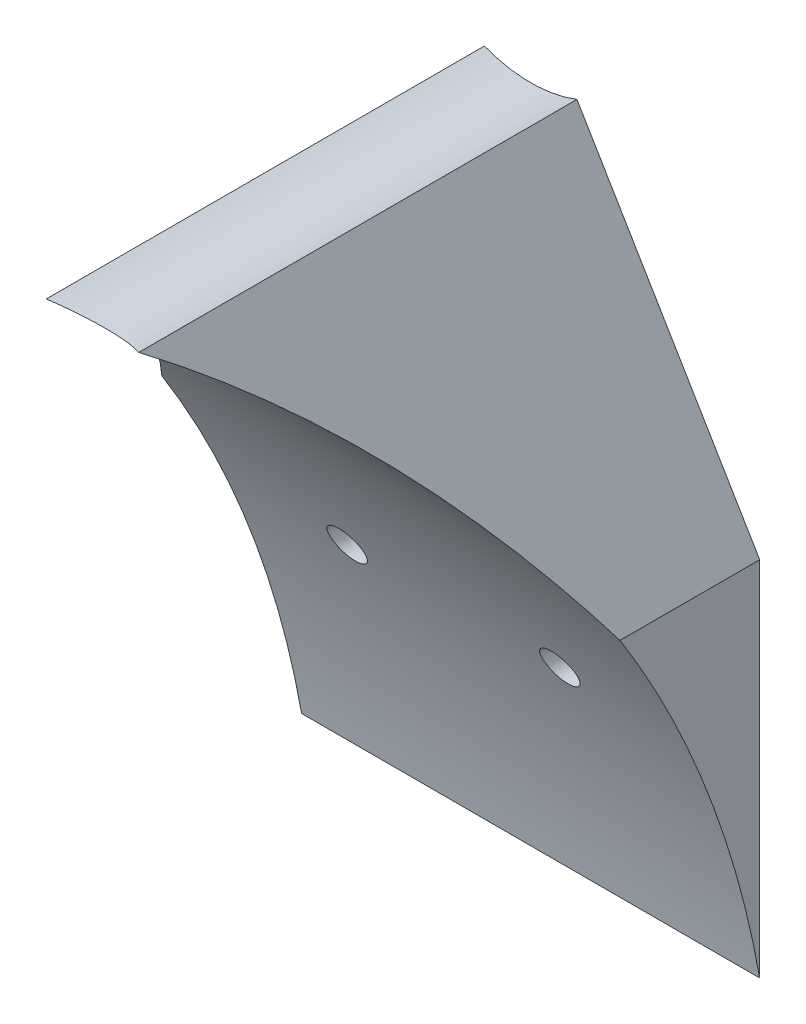
ISO-10303-21;
HEADER;
FILE_DESCRIPTION(('STEP AP214'),'2;1');
FILE_NAME('part.step','',(''),(''),'','','');
FILE_SCHEMA(('AUTOMOTIVE_DESIGN { 1 0 10303 214 1 1 1 1 }'));
ENDSEC;
DATA;
#1=APPLICATION_CONTEXT('core data for automotive mechanical design processes');
#2=APPLICATION_PROTOCOL_DEFINITION('international standard','automotive_design',2000,#1);
#3=PRODUCT_CONTEXT('',#1,'mechanical');
#4=PRODUCT('Part','Part','',(#3));
#5=PRODUCT_RELATED_PRODUCT_CATEGORY('part','',(#4));
#6=PRODUCT_DEFINITION_FORMATION('','',#4);
#7=PRODUCT_DEFINITION_CONTEXT('part definition',#1,'design');
#8=PRODUCT_DEFINITION('design','',#6,#7);
#9=PRODUCT_DEFINITION_SHAPE('','',#8);
#10=(LENGTH_UNIT() NAMED_UNIT(*) SI_UNIT(.MILLI.,.METRE.));
#11=(NAMED_UNIT(*) PLANE_ANGLE_UNIT() SI_UNIT($,.RADIAN.));
#12=(NAMED_UNIT(*) SI_UNIT($,.STERADIAN.) SOLID_ANGLE_UNIT());
#13=UNCERTAINTY_MEASURE_WITH_UNIT(LENGTH_MEASURE(1.E-05),#10,'distance_accuracy_value','');
#14=(GEOMETRIC_REPRESENTATION_CONTEXT(3) GLOBAL_UNCERTAINTY_ASSIGNED_CONTEXT((#13)) GLOBAL_UNIT_ASSIGNED_CONTEXT((#10,
#11,#12)) REPRESENTATION_CONTEXT('',''));
#15=CARTESIAN_POINT('',(0.,0.,0.));
#16=DIRECTION('',(0.,0.,1.));
#17=DIRECTION('',(1.,0.,0.));
#18=AXIS2_PLACEMENT_3D('',#15,#16,#17);
#19=CARTESIAN_POINT('',(34.1980331590714,-120.876287401462,76.2));
#20=DIRECTION('',(-1.,0.,0.));
#21=DIRECTION('',(0.,0.,1.));
#22=AXIS2_PLACEMENT_3D('',#19,#20,#21);
#23=PLANE('',#22);
#24=CARTESIAN_POINT('',(34.1980331590714,-147.678127899183,150.024735780253));
#25=DIRECTION('',(-1.,0.,0.));
#26=DIRECTION('',(0.,0.,1.));
#27=AXIS2_PLACEMENT_3D('',#24,#25,#26);
#28=CIRCLE('',#27,152.4);
#29=CARTESIAN_POINT('',(34.1980331590714,-66.7963441862353,20.8585751056708));
#30=VERTEX_POINT('',#29);
#31=CARTESIAN_POINT('',(34.1980331590714,-120.876287401462,0.));
#32=VERTEX_POINT('',#31);
#33=EDGE_CURVE('E160',#30,#32,#28,.T.);
#34=ORIENTED_EDGE('',*,*,#33,.T.);
#35=DIRECTION('',(0.,1.,0.));
#36=VECTOR('',#35,1.);
#37=CARTESIAN_POINT('',(34.1980331590714,-120.876287401462,0.));
#38=LINE('',#37,#36);
#39=CARTESIAN_POINT('',(34.1980331590714,-66.7963441862352,0.));
#40=VERTEX_POINT('',#39);
#41=EDGE_CURVE('E108',#32,#40,#38,.T.);
#42=ORIENTED_EDGE('',*,*,#41,.T.);
#43=DIRECTION('',(0.,0.,-1.));
#44=VECTOR('',#43,1.);
#45=CARTESIAN_POINT('',(34.1980331590714,-66.7963441862352,76.2));
#46=LINE('',#45,#44);
#47=EDGE_CURVE('E11',#30,#40,#46,.T.);
#48=ORIENTED_EDGE('',*,*,#47,.F.);
#49=EDGE_LOOP('',(#34,#42,#48));
#50=FACE_BOUND('',#49,.T.);
#51=ADVANCED_FACE('F33',(#50),#23,.F.);
#52=CARTESIAN_POINT('',(0.,-9.3146184247097,76.2));
#53=DIRECTION('',(-0.859406411501452,-0.511293086077053,0.));
#54=DIRECTION('',(0.511293086077053,-0.859406411501452,0.));
#55=AXIS2_PLACEMENT_3D('',#52,#53,#54);
#56=PLANE('',#55);
#57=DIRECTION('',(-0.511293086077053,0.859406411501452,0.));
#58=VECTOR('',#57,1.);
#59=CARTESIAN_POINT('',(0.,-9.3146184247097,0.));
#60=LINE('',#59,#58);
#61=CARTESIAN_POINT('',(6.9091808708857,-20.9279073588916,0.));
#62=VERTEX_POINT('',#61);
#63=EDGE_CURVE('E105',#40,#62,#60,.T.);
#64=ORIENTED_EDGE('',*,*,#63,.T.);
#65=DIRECTION('',(0.,0.,-1.));
#66=VECTOR('',#65,1.);
#67=CARTESIAN_POINT('',(6.9091808708857,-20.9279073588916,68.2635));
#68=LINE('',#67,#66);
#69=CARTESIAN_POINT('',(6.90918087088567,-20.9279073588916,65.4071159071581));
#70=VERTEX_POINT('',#69);
#71=EDGE_CURVE('E86',#70,#62,#68,.T.);
#72=ORIENTED_EDGE('',*,*,#71,.F.);
#73=CARTESIAN_POINT('',(82.3176378636259,-147.678127899183,150.024735780253));
#74=DIRECTION('',(-0.859406411501452,-0.511293086077053,0.));
#75=DIRECTION('',(-0.511293086077053,0.859406411501452,0.));
#76=AXIS2_PLACEMENT_3D('',#73,#74,#75);
#77=ELLIPSE('',#76,177.331700066962,152.4);
#78=EDGE_CURVE('E165',#30,#70,#77,.F.);
#79=ORIENTED_EDGE('',*,*,#78,.F.);
#80=ORIENTED_EDGE('',*,*,#47,.T.);
#81=EDGE_LOOP('',(#64,#72,#79,#80));
#82=FACE_BOUND('',#81,.T.);
#83=ADVANCED_FACE('F174',(#82),#56,.F.);
#84=CARTESIAN_POINT('',(0.,-9.3146184247097,76.2));
#85=DIRECTION('',(0.859406411501452,-0.511293086077053,0.));
#86=DIRECTION('',(0.511293086077053,0.859406411501452,0.));
#87=AXIS2_PLACEMENT_3D('',#84,#85,#86);
#88=PLANE('',#87);
#89=CARTESIAN_POINT('',(-82.3176378636259,-147.678127899183,150.024735780253));
#90=DIRECTION('',(0.859406411501452,-0.511293086077053,0.));
#91=DIRECTION('',(-0.511293086077053,-0.859406411501452,0.));
#92=AXIS2_PLACEMENT_3D('',#89,#90,#91);
#93=ELLIPSE('',#92,177.331700066962,152.4);
#94=CARTESIAN_POINT('',(-6.9091808708857,-20.9279073588916,65.4071159071581));
#95=VERTEX_POINT('',#94);
#96=CARTESIAN_POINT('',(-34.1980331590714,-66.7963441862353,20.8585751056708));
#97=VERTEX_POINT('',#96);
#98=EDGE_CURVE('E99',#95,#97,#93,.F.);
#99=ORIENTED_EDGE('',*,*,#98,.F.);
#100=DIRECTION('',(0.,0.,-1.));
#101=VECTOR('',#100,1.);
#102=CARTESIAN_POINT('',(-6.90918087088569,-20.9279073588916,68.2635));
#103=LINE('',#102,#101);
#104=CARTESIAN_POINT('',(-6.90918087088569,-20.9279073588916,0.));
#105=VERTEX_POINT('',#104);
#106=EDGE_CURVE('E54',#105,#95,#103,.F.);
#107=ORIENTED_EDGE('',*,*,#106,.F.);
#108=DIRECTION('',(-0.511293086077053,-0.859406411501452,0.));
#109=VECTOR('',#108,1.);
#110=CARTESIAN_POINT('',(0.,-9.3146184247097,0.));
#111=LINE('',#110,#109);
#112=CARTESIAN_POINT('',(-34.1980331590714,-66.7963441862353,0.));
#113=VERTEX_POINT('',#112);
#114=EDGE_CURVE('E97',#105,#113,#111,.T.);
#115=ORIENTED_EDGE('',*,*,#114,.T.);
#116=DIRECTION('',(0.,0.,-1.));
#117=VECTOR('',#116,1.);
#118=CARTESIAN_POINT('',(-34.1980331590714,-66.7963441862353,76.2));
#119=LINE('',#118,#117);
#120=EDGE_CURVE('E46',#97,#113,#119,.T.);
#121=ORIENTED_EDGE('',*,*,#120,.F.);
#122=EDGE_LOOP('',(#99,#107,#115,#121));
#123=FACE_BOUND('',#122,.T.);
#124=ADVANCED_FACE('F95',(#123),#88,.F.);
#125=CARTESIAN_POINT('',(-34.1980331590714,-66.7963441862353,76.2));
#126=DIRECTION('',(1.,0.,0.));
#127=DIRECTION('',(0.,1.,0.));
#128=AXIS2_PLACEMENT_3D('',#125,#126,#127);
#129=PLANE('',#128);
#130=CARTESIAN_POINT('',(-34.1980331590714,-147.678127899183,150.024735780253));
#131=DIRECTION('',(1.,0.,0.));
#132=DIRECTION('',(0.,1.,0.));
#133=AXIS2_PLACEMENT_3D('',#130,#131,#132);
#134=CIRCLE('',#133,152.4);
#135=CARTESIAN_POINT('',(-34.1980331590714,-120.876287401462,0.));
#136=VERTEX_POINT('',#135);
#137=EDGE_CURVE('E62',#136,#97,#134,.T.);
#138=ORIENTED_EDGE('',*,*,#137,.T.);
#139=ORIENTED_EDGE('',*,*,#120,.T.);
#140=DIRECTION('',(0.,-1.,0.));
#141=VECTOR('',#140,1.);
#142=CARTESIAN_POINT('',(-34.1980331590714,-66.7963441862353,0.));
#143=LINE('',#142,#141);
#144=EDGE_CURVE('E104',#113,#136,#143,.T.);
#145=ORIENTED_EDGE('',*,*,#144,.T.);
#146=EDGE_LOOP('',(#138,#139,#145));
#147=FACE_BOUND('',#146,.T.);
#148=ADVANCED_FACE('F178',(#147),#129,.F.);
#149=CARTESIAN_POINT('',(0.,0.,0.));
#150=DIRECTION('',(0.,0.,1.));
#151=DIRECTION('',(1.,0.,0.));
#152=AXIS2_PLACEMENT_3D('',#149,#150,#151);
#153=PLANE('',#152);
#154=CARTESIAN_POINT('',(15.875,-84.1140505290356,0.));
#155=DIRECTION('',(0.,0.,-1.));
#156=DIRECTION('',(-1.,0.,0.));
#157=AXIS2_PLACEMENT_3D('',#154,#155,#156);
#158=CIRCLE('',#157,2.74999999999999);
#159=CARTESIAN_POINT('',(13.125,-84.1140505290356,0.));
#160=VERTEX_POINT('',#159);
#161=EDGE_CURVE('E151',#160,#160,#158,.T.);
#162=ORIENTED_EDGE('',*,*,#161,.F.);
#163=EDGE_LOOP('',(#162));
#164=FACE_BOUND('',#163,.T.);
#165=CARTESIAN_POINT('',(-15.875,-84.1140505290356,0.));
#166=DIRECTION('',(0.,0.,-1.));
#167=DIRECTION('',(-1.,0.,0.));
#168=AXIS2_PLACEMENT_3D('',#165,#166,#167);
#169=CIRCLE('',#168,2.74999999999999);
#170=CARTESIAN_POINT('',(-18.625,-84.1140505290356,0.));
#171=VERTEX_POINT('',#170);
#172=EDGE_CURVE('E155',#171,#171,#169,.T.);
#173=ORIENTED_EDGE('',*,*,#172,.F.);
#174=EDGE_LOOP('',(#173));
#175=FACE_BOUND('',#174,.T.);
#176=CARTESIAN_POINT('',(0.,-41.7128728082366,0.));
#177=DIRECTION('',(0.,0.,-1.));
#178=DIRECTION('',(-1.,0.,0.));
#179=AXIS2_PLACEMENT_3D('',#176,#177,#178);
#180=CIRCLE('',#179,2.74999999999999);
#181=CARTESIAN_POINT('',(-2.74999999999999,-41.7128728082366,0.));
#182=VERTEX_POINT('',#181);
#183=EDGE_CURVE('E119',#182,#182,#180,.T.);
#184=ORIENTED_EDGE('',*,*,#183,.F.);
#185=EDGE_LOOP('',(#184));
#186=FACE_BOUND('',#185,.T.);
#187=ORIENTED_EDGE('',*,*,#114,.F.);
#188=CARTESIAN_POINT('',(0.,-3.175,0.));
#189=DIRECTION('',(0.,0.,-1.));
#190=DIRECTION('',(-1.,0.,0.));
#191=AXIS2_PLACEMENT_3D('',#188,#189,#190);
#192=CIRCLE('',#191,19.05);
#193=EDGE_CURVE('E83',#62,#105,#192,.T.);
#194=ORIENTED_EDGE('',*,*,#193,.F.);
#195=ORIENTED_EDGE('',*,*,#63,.F.);
#196=ORIENTED_EDGE('',*,*,#41,.F.);
#197=DIRECTION('',(1.,0.,0.));
#198=VECTOR('',#197,1.);
#199=CARTESIAN_POINT('',(34.1980331590714,-120.876287401462,0.));
#200=LINE('',#199,#198);
#201=EDGE_CURVE('E168',#136,#32,#200,.T.);
#202=ORIENTED_EDGE('',*,*,#201,.F.);
#203=ORIENTED_EDGE('',*,*,#144,.F.);
#204=EDGE_LOOP('',(#187,#194,#195,#196,#202,#203));
#205=FACE_BOUND('',#204,.T.);
#206=ADVANCED_FACE('F102',(#164,#175,#186,#205),#153,.F.);
#207=CARTESIAN_POINT('',(169.299646713013,-147.678127899183,150.024735780253));
#208=DIRECTION('',(-1.,0.,0.));
#209=DIRECTION('',(0.,0.,1.));
#210=AXIS2_PLACEMENT_3D('',#207,#208,#209);
#211=CYLINDRICAL_SURFACE('',#210,152.4);
#212=CARTESIAN_POINT('',(10.5038725305,-19.0674875920357,68.2625));
#213=CARTESIAN_POINT('',(10.2422460662948,-19.2403791510492,67.9905265457169));
#214=CARTESIAN_POINT('',(9.97129166063821,-19.4102032431336,67.7253194185323));
#215=CARTESIAN_POINT('',(9.40969361477791,-19.7420437939417,67.2104159094847));
#216=CARTESIAN_POINT('',(9.11902193487828,-19.9040485481998,66.9607426274672));
#217=CARTESIAN_POINT('',(8.5146478937666,-20.2196645829105,66.4772372042344));
#218=CARTESIAN_POINT('',(8.20074096836411,-20.3731734683273,66.2435924873617));
#219=CARTESIAN_POINT('',(7.55245293418476,-20.6675584629268,65.7979794961586));
#220=CARTESIAN_POINT('',(7.2180824810408,-20.8084410541726,65.5860000913926));
#221=CARTESIAN_POINT('',(6.58046852121156,-21.0551201623784,65.2166249552182));
#222=CARTESIAN_POINT('',(6.28002374732187,-21.1630154282291,65.0558040830248));
#223=CARTESIAN_POINT('',(5.66500670730317,-21.366070345704,64.7542416753495));
#224=CARTESIAN_POINT('',(5.35043424880984,-21.461229823846,64.613500413383));
#225=CARTESIAN_POINT('',(4.70935821049898,-21.6367031405593,64.354766565452));
#226=CARTESIAN_POINT('',(4.38289947804388,-21.7170670043725,64.2366972631706));
#227=CARTESIAN_POINT('',(3.71866877388422,-21.8616126910129,64.0248463986711));
#228=CARTESIAN_POINT('',(3.38089709410464,-21.925794931035,63.9310642102806));
#229=CARTESIAN_POINT('',(2.69284902815418,-22.0369637990943,63.7689088494293));
#230=CARTESIAN_POINT('',(2.3424816270245,-22.0837728699551,63.7007979387956));
#231=CARTESIAN_POINT('',(1.63535073568911,-22.1580052579475,63.5928948346133));
#232=CARTESIAN_POINT('',(1.27858717437361,-22.185428359417,63.5531029561039));
#233=CARTESIAN_POINT('',(0.561939066095909,-22.2200898102641,63.5028216622572));
#234=CARTESIAN_POINT('',(0.202053881082424,-22.2273239306621,63.4923383861829));
#235=CARTESIAN_POINT('',(-0.517167523616115,-22.2213729420714,63.5009663552994));
#236=CARTESIAN_POINT('',(-0.87650379914097,-22.2081900707782,63.520074357296));
#237=CARTESIAN_POINT('',(-1.54081945778279,-22.1650798349984,63.5826399423484));
#238=CARTESIAN_POINT('',(-1.84633833724122,-22.1377671720896,63.6222964990073));
#239=CARTESIAN_POINT('',(-2.45228970190975,-22.0689600634561,63.7223566496269));
#240=CARTESIAN_POINT('',(-2.75272287280481,-22.0274675457854,63.7827574229736));
#241=CARTESIAN_POINT('',(-3.34671011649772,-21.9311340927908,63.9232794408619));
#242=CARTESIAN_POINT('',(-3.64026467074684,-21.8762940947677,64.0033993006736));
#243=CARTESIAN_POINT('',(-4.21908436698351,-21.754272326928,64.1821222648937));
#244=CARTESIAN_POINT('',(-4.5043478208583,-21.6870880638595,64.2807291033202));
#245=CARTESIAN_POINT('',(-5.15249671339323,-21.5188939923249,64.528323574652));
#246=CARTESIAN_POINT('',(-5.51200409476117,-21.4138568100006,64.683450199557));
#247=CARTESIAN_POINT('',(-6.21307402388439,-21.1871092901523,65.0198927593089));
#248=CARTESIAN_POINT('',(-6.55463044009558,-21.0653933061738,65.2012175644434));
#249=CARTESIAN_POINT('',(-7.21953033812174,-20.8075921468442,65.5872967285692));
#250=CARTESIAN_POINT('',(-7.54283372662361,-20.671477093334,65.7920998819491));
#251=CARTESIAN_POINT('',(-8.17010891041565,-20.3875049385456,66.2218499728324));
#252=CARTESIAN_POINT('',(-8.47408535799762,-20.2396506824918,66.4467920309566));
#253=CARTESIAN_POINT('',(-9.07932669177525,-19.9258498058024,66.9271905726621));
#254=CARTESIAN_POINT('',(-9.37950806808826,-19.7593546407142,67.183647224));
#255=CARTESIAN_POINT('',(-9.9576078381941,-19.4187728668045,67.7119367689481));
#256=CARTESIAN_POINT('',(-10.2356485566997,-19.2447375711296,67.9836686140446));
#257=CARTESIAN_POINT('',(-10.5038725305,-19.0674875920357,68.2625));
#258=B_SPLINE_CURVE_WITH_KNOTS('',3,(#212,#213,#214,#215,#216,#217,#218,#219,#220,#221,#222,
#223,#224,#225,#226,#227,#228,#229,#230,#231,#232,#233,#234,#235,#236,#237,#238,#239,#240,#241,
#242,#243,#244,#245,#246,#247,#248,#249,#250,#251,#252,#253,#254,#255,#256,#257),.UNSPECIFIED.,
.F.,.F.,(4,2,2,2,2,2,2,2,2,2,2,2,2,2,2,2,2,2,2,2,2,2,4),(0.,1.24538617120041,2.4925821045822,
3.75249161344454,5.01175056225957,6.08313591018578,7.15453585065311,8.22224395994019,
9.28992453874636,10.3682347024104,11.4465568617078,12.5251048798625,13.6035346978778,
14.5303466649435,15.4570326622309,16.3836536035697,17.3104619067452,18.5248332478455,
19.739616723549,20.956972253113,22.1740336282974,23.4585314740094,24.7353530657188),.UNSPECIFIED.);
#259=EDGE_CURVE('E91',#70,#95,#258,.T.);
#260=ORIENTED_EDGE('',*,*,#259,.T.);
#261=ORIENTED_EDGE('',*,*,#98,.T.);
#262=ORIENTED_EDGE('',*,*,#137,.F.);
#263=ORIENTED_EDGE('',*,*,#201,.T.);
#264=ORIENTED_EDGE('',*,*,#33,.F.);
#265=ORIENTED_EDGE('',*,*,#78,.T.);
#266=EDGE_LOOP('',(#260,#261,#262,#263,#264,#265));
#267=FACE_BOUND('',#266,.T.);
#268=CARTESIAN_POINT('',(13.125,-84.1140505290356,11.5134796741807));
#269=CARTESIAN_POINT('',(13.1250053712107,-84.2798738427803,11.4373823632753));
#270=CARTESIAN_POINT('',(13.1400253017321,-84.4459642664081,11.3615256391851));
#271=CARTESIAN_POINT('',(13.2001558388077,-84.7740339707113,11.212389288553));
#272=CARTESIAN_POINT('',(13.245306676036,-84.9360074539053,11.1391132456216));
#273=CARTESIAN_POINT('',(13.3654328637713,-85.2511755242352,10.9971646565278));
#274=CARTESIAN_POINT('',(13.4404673817633,-85.4043520013655,10.9285015607621));
#275=CARTESIAN_POINT('',(13.6192518890085,-85.6962508773994,10.7981848787486));
#276=CARTESIAN_POINT('',(13.7229864774993,-85.8349809735845,10.7365275580897));
#277=CARTESIAN_POINT('',(13.9504816836012,-86.0852715244942,10.6256763616333));
#278=CARTESIAN_POINT('',(14.0727985537186,-86.1979173091841,10.5759784217427));
#279=CARTESIAN_POINT('',(14.3381505979295,-86.4006230276711,10.4867850419304));
#280=CARTESIAN_POINT('',(14.4811733464167,-86.4906964192599,10.4472835224197));
#281=CARTESIAN_POINT('',(14.7699021186147,-86.636956222647,10.3832620673336));
#282=CARTESIAN_POINT('',(14.9142042284142,-86.6954653111093,10.3577126634893));
#283=CARTESIAN_POINT('',(15.2120068823795,-86.7874725362714,10.3175754589091));
#284=CARTESIAN_POINT('',(15.3655024961004,-86.8209839516654,10.302981838465));
#285=CARTESIAN_POINT('',(15.6652574092465,-86.8598981025919,10.2860391604052));
#286=CARTESIAN_POINT('',(15.8112313195334,-86.8671675302329,10.2828769201352));
#287=CARTESIAN_POINT('',(16.1023405691556,-86.8585006481465,10.2866487492342));
#288=CARTESIAN_POINT('',(16.2474760709258,-86.8425689959235,10.2935807922249));
#289=CARTESIAN_POINT('',(16.5290775165303,-86.7888828780091,10.3169670099621));
#290=CARTESIAN_POINT('',(16.6656690933581,-86.7516777696677,10.3331814909483));
#291=CARTESIAN_POINT('',(16.9303752802496,-86.6573614439525,10.3743555748036));
#292=CARTESIAN_POINT('',(17.0584892396372,-86.6002487007268,10.3993158480085));
#293=CARTESIAN_POINT('',(17.3066621636493,-86.4663437212842,10.4579670071217));
#294=CARTESIAN_POINT('',(17.4263911265627,-86.3890408982511,10.4918847111683));
#295=CARTESIAN_POINT('',(17.6511176672706,-86.2182935670919,10.5670093891205));
#296=CARTESIAN_POINT('',(17.7561114412364,-86.1248449048229,10.6082182390216));
#297=CARTESIAN_POINT('',(17.9560850104634,-85.917845026102,10.6997879377453));
#298=CARTESIAN_POINT('',(18.0498977974392,-85.8033587702288,10.7505806554728));
#299=CARTESIAN_POINT('',(18.2170941795935,-85.5627007793623,10.8577458955394));
#300=CARTESIAN_POINT('',(18.2904705393807,-85.4365249267549,10.9141203845194));
#301=CARTESIAN_POINT('',(18.4212079453938,-85.1647376608761,11.0360311323388));
#302=CARTESIAN_POINT('',(18.4766834056849,-85.0183854362822,11.1019389203702));
#303=CARTESIAN_POINT('',(18.5619468166747,-84.7198117733575,11.2369938476355));
#304=CARTESIAN_POINT('',(18.5917253017929,-84.5675881938415,11.3061421706532));
#305=CARTESIAN_POINT('',(18.6266153180924,-84.2498974009565,11.4511012657552));
#306=CARTESIAN_POINT('',(18.6297846364708,-84.0842693389197,11.5270319132201));
#307=CARTESIAN_POINT('',(18.606452849253,-83.7549895176399,11.6787012478778));
#308=CARTESIAN_POINT('',(18.5799434963484,-83.5913383205179,11.7544398758477));
#309=CARTESIAN_POINT('',(18.4964433305106,-83.2657681899463,11.9057977089647));
#310=CARTESIAN_POINT('',(18.4385904597249,-83.1040372740205,11.9813496938686));
#311=CARTESIAN_POINT('',(18.2926837390939,-82.7923461001808,12.1275821992696));
#312=CARTESIAN_POINT('',(18.204631217138,-82.6423853250859,12.1982629337933));
#313=CARTESIAN_POINT('',(18.0034398337469,-82.3645916100206,12.3296930827008));
#314=CARTESIAN_POINT('',(17.8912987373299,-82.2361635030856,12.3907053915727));
#315=CARTESIAN_POINT('',(17.6425787471158,-82.000412627329,12.5030473409282));
#316=CARTESIAN_POINT('',(17.5060155402516,-81.8930764030055,12.5543831536453));
#317=CARTESIAN_POINT('',(17.2255515518317,-81.7132818281516,12.6405731247499));
#318=CARTESIAN_POINT('',(17.0834480065595,-81.6385390922584,12.6765016994428));
#319=CARTESIAN_POINT('',(16.7862155824221,-81.5144239028186,12.7362473127764));
#320=CARTESIAN_POINT('',(16.6310971267573,-81.4650313685897,12.7600739375921));
#321=CARTESIAN_POINT('',(16.3290044346407,-81.3978194236469,12.7925166837775));
#322=CARTESIAN_POINT('',(16.1827527080453,-81.3773502174942,12.8024090453728));
#323=CARTESIAN_POINT('',(15.8885539308245,-81.3601441289839,12.8107236109729));
#324=CARTESIAN_POINT('',(15.7406075157151,-81.3633986234054,12.8091499826986));
#325=CARTESIAN_POINT('',(15.4553101299523,-81.3926782716544,12.7950036030749));
#326=CARTESIAN_POINT('',(15.3178064424122,-81.4175193402931,12.7830028155994));
#327=CARTESIAN_POINT('',(15.0492525090082,-81.487286304557,12.7493411330209));
#328=CARTESIAN_POINT('',(14.9182024648289,-81.5322128274362,12.7276799362304));
#329=CARTESIAN_POINT('',(14.66341821227,-81.6413716434488,12.6751433630316));
#330=CARTESIAN_POINT('',(14.5398668701336,-81.7059495805148,12.6441030957764));
#331=CARTESIAN_POINT('',(14.3054692768437,-81.8517202439467,12.5741971335057));
#332=CARTESIAN_POINT('',(14.1946258573713,-81.9329166621927,12.5353296996763));
#333=CARTESIAN_POINT('',(13.9799630234022,-82.1158859359053,12.4479811245369));
#334=CARTESIAN_POINT('',(13.8772651345928,-82.2187348996393,12.3990022716303));
#335=CARTESIAN_POINT('',(13.690410955828,-82.4375085544635,12.2951592380055));
#336=CARTESIAN_POINT('',(13.6062666216587,-82.5534416045392,12.2402912960536));
#337=CARTESIAN_POINT('',(13.4504474521574,-82.80703748681,12.1206999088171));
#338=CARTESIAN_POINT('',(13.3807672160479,-82.9457174636917,12.0555365526225));
#339=CARTESIAN_POINT('',(13.2660070371707,-83.2312651194945,11.9219238012672));
#340=CARTESIAN_POINT('',(13.2209082391702,-83.3781264273296,11.8534769686764));
#341=CARTESIAN_POINT('',(13.167260855166,-83.6237347292867,11.7395012874806));
#342=CARTESIAN_POINT('',(13.1514292422509,-83.7211597139919,11.6944142805213));
#343=CARTESIAN_POINT('',(13.1302969390634,-83.917041823659,11.604016422216));
#344=CARTESIAN_POINT('',(13.1249968078011,-84.015499003131,11.5587055591158));
#345=CARTESIAN_POINT('',(13.125,-84.1140505290356,11.5134796741807));
#346=B_SPLINE_CURVE_WITH_KNOTS('',3,(#268,#269,#270,#271,#272,#273,#274,#275,#276,#277,#278,
#279,#280,#281,#282,#283,#284,#285,#286,#287,#288,#289,#290,#291,#292,#293,#294,#295,#296,#297,
#298,#299,#300,#301,#302,#303,#304,#305,#306,#307,#308,#309,#310,#311,#312,#313,#314,#315,#316,
#317,#318,#319,#320,#321,#322,#323,#324,#325,#326,#327,#328,#329,#330,#331,#332,#333,#334,#335,
#336,#337,#338,#339,#340,#341,#342,#343,#344,#345),.UNSPECIFIED.,.T.,.F.,(4,2,2,2,2,2,2,2,2,2,2,
2,2,2,2,2,2,2,2,2,2,2,2,2,2,2,2,2,2,2,2,2,2,2,2,2,2,2,4),(0.,0.546971047300558,1.09467387340177,
1.64346654508805,2.19196529807513,2.70980051504205,3.22732625716955,3.6982030971033,
4.16882963010289,4.60523536298836,5.0415535016141,5.46708273141667,5.89264458374891,
6.33023426670481,6.76793670467797,7.23541311474934,7.70305482218752,8.21034983527576,
8.71783163278412,9.26205920438552,9.80643804714588,10.3666112092733,10.9267597435432,
11.4670903822846,12.0070751916187,12.4979442489732,12.9884238712331,13.4301623772841,
13.871740325808,14.2905241783853,14.709321110189,15.1359575377823,15.5626888479015,
16.0209029290084,16.4794114228289,16.982289175252,17.4847806496697,17.809837296314,
18.1349111964779),.UNSPECIFIED.);
#347=CARTESIAN_POINT('',(13.125,-84.1140505290356,11.5134796741807));
#348=VERTEX_POINT('',#347);
#349=EDGE_CURVE('E36',#348,#348,#346,.T.);
#350=ORIENTED_EDGE('',*,*,#349,.F.);
#351=EDGE_LOOP('',(#350));
#352=FACE_BOUND('',#351,.T.);
#353=CARTESIAN_POINT('',(-18.625,-84.1140505290356,11.5134796741807));
#354=CARTESIAN_POINT('',(-18.6249946287893,-84.2798738427803,11.4373823632753));
#355=CARTESIAN_POINT('',(-18.6099746982679,-84.4459642664081,11.3615256391851));
#356=CARTESIAN_POINT('',(-18.5498441611923,-84.7740339707113,11.212389288553));
#357=CARTESIAN_POINT('',(-18.504693323964,-84.9360074539053,11.1391132456216));
#358=CARTESIAN_POINT('',(-18.3845671362287,-85.2511755242352,10.9971646565278));
#359=CARTESIAN_POINT('',(-18.3095326182367,-85.4043520013655,10.9285015607621));
#360=CARTESIAN_POINT('',(-18.1307481109915,-85.6962508773994,10.7981848787486));
#361=CARTESIAN_POINT('',(-18.0270135225008,-85.8349809735845,10.7365275580897));
#362=CARTESIAN_POINT('',(-17.7995183163988,-86.0852715244942,10.6256763616333));
#363=CARTESIAN_POINT('',(-17.6772014462814,-86.1979173091841,10.5759784217427));
#364=CARTESIAN_POINT('',(-17.4118494020705,-86.4006230276711,10.4867850419304));
#365=CARTESIAN_POINT('',(-17.2688266535833,-86.4906964192599,10.4472835224197));
#366=CARTESIAN_POINT('',(-16.9800978813853,-86.636956222647,10.3832620673336));
#367=CARTESIAN_POINT('',(-16.8357957715858,-86.6954653111093,10.3577126634893));
#368=CARTESIAN_POINT('',(-16.5379931176205,-86.7874725362714,10.317575458909));
#369=CARTESIAN_POINT('',(-16.3844975038996,-86.8209839516654,10.302981838465));
#370=CARTESIAN_POINT('',(-16.0847425907535,-86.8598981025919,10.2860391604052));
#371=CARTESIAN_POINT('',(-15.9387686804666,-86.8671675302329,10.2828769201352));
#372=CARTESIAN_POINT('',(-15.6476594308444,-86.8585006481465,10.2866487492342));
#373=CARTESIAN_POINT('',(-15.5025239290742,-86.8425689959235,10.2935807922248));
#374=CARTESIAN_POINT('',(-15.2209224834697,-86.7888828780091,10.3169670099621));
#375=CARTESIAN_POINT('',(-15.0843309066419,-86.7516777696677,10.3331814909483));
#376=CARTESIAN_POINT('',(-14.8196247197504,-86.6573614439525,10.3743555748036));
#377=CARTESIAN_POINT('',(-14.6915107603628,-86.6002487007268,10.3993158480084));
#378=CARTESIAN_POINT('',(-14.4433378363507,-86.4663437212842,10.4579670071217));
#379=CARTESIAN_POINT('',(-14.3236088734373,-86.3890408982511,10.4918847111683));
#380=CARTESIAN_POINT('',(-14.0988823327295,-86.2182935670919,10.5670093891205));
#381=CARTESIAN_POINT('',(-13.9938885587636,-86.1248449048229,10.6082182390216));
#382=CARTESIAN_POINT('',(-13.7939149895366,-85.917845026102,10.6997879377453));
#383=CARTESIAN_POINT('',(-13.7001022025608,-85.8033587702288,10.7505806554728));
#384=CARTESIAN_POINT('',(-13.5329058204065,-85.5627007793623,10.8577458955394));
#385=CARTESIAN_POINT('',(-13.4595294606193,-85.4365249267549,10.9141203845194));
#386=CARTESIAN_POINT('',(-13.3287920546062,-85.1647376608761,11.0360311323387));
#387=CARTESIAN_POINT('',(-13.2733165943151,-85.0183854362822,11.1019389203702));
#388=CARTESIAN_POINT('',(-13.1880531833253,-84.7198117733575,11.2369938476355));
#389=CARTESIAN_POINT('',(-13.1582746982071,-84.5675881938415,11.3061421706532));
#390=CARTESIAN_POINT('',(-13.1233846819076,-84.2498974009565,11.4511012657552));
#391=CARTESIAN_POINT('',(-13.1202153635292,-84.0842693389197,11.5270319132201));
#392=CARTESIAN_POINT('',(-13.143547150747,-83.7549895176399,11.6787012478778));
#393=CARTESIAN_POINT('',(-13.1700565036516,-83.5913383205179,11.7544398758477));
#394=CARTESIAN_POINT('',(-13.2535566694894,-83.2657681899463,11.9057977089646));
#395=CARTESIAN_POINT('',(-13.3114095402751,-83.1040372740205,11.9813496938685));
#396=CARTESIAN_POINT('',(-13.4573162609061,-82.7923461001808,12.1275821992696));
#397=CARTESIAN_POINT('',(-13.545368782862,-82.6423853250859,12.1982629337933));
#398=CARTESIAN_POINT('',(-13.7465601662532,-82.3645916100206,12.3296930827008));
#399=CARTESIAN_POINT('',(-13.8587012626701,-82.2361635030856,12.3907053915727));
#400=CARTESIAN_POINT('',(-14.1074212528842,-82.000412627329,12.5030473409282));
#401=CARTESIAN_POINT('',(-14.2439844597484,-81.8930764030055,12.5543831536453));
#402=CARTESIAN_POINT('',(-14.5244484481683,-81.7132818281516,12.6405731247499));
#403=CARTESIAN_POINT('',(-14.6665519934405,-81.6385390922584,12.6765016994428));
#404=CARTESIAN_POINT('',(-14.9637844175779,-81.5144239028186,12.7362473127764));
#405=CARTESIAN_POINT('',(-15.1189028732427,-81.4650313685897,12.7600739375921));
#406=CARTESIAN_POINT('',(-15.4209955653593,-81.3978194236469,12.7925166837775));
#407=CARTESIAN_POINT('',(-15.5672472919547,-81.3773502174942,12.8024090453728));
#408=CARTESIAN_POINT('',(-15.8614460691755,-81.3601441289839,12.8107236109729));
#409=CARTESIAN_POINT('',(-16.0093924842849,-81.3633986234054,12.8091499826986));
#410=CARTESIAN_POINT('',(-16.2946898700477,-81.3926782716544,12.7950036030749));
#411=CARTESIAN_POINT('',(-16.4321935575879,-81.4175193402931,12.7830028155994));
#412=CARTESIAN_POINT('',(-16.7007474909918,-81.487286304557,12.7493411330208));
#413=CARTESIAN_POINT('',(-16.8317975351711,-81.5322128274362,12.7276799362303));
#414=CARTESIAN_POINT('',(-17.08658178773,-81.6413716434488,12.6751433630316));
#415=CARTESIAN_POINT('',(-17.2101331298664,-81.7059495805148,12.6441030957764));
#416=CARTESIAN_POINT('',(-17.4445307231563,-81.8517202439467,12.5741971335057));
#417=CARTESIAN_POINT('',(-17.5553741426288,-81.9329166621927,12.5353296996762));
#418=CARTESIAN_POINT('',(-17.7700369765978,-82.1158859359053,12.4479811245369));
#419=CARTESIAN_POINT('',(-17.8727348654072,-82.2187348996393,12.3990022716303));
#420=CARTESIAN_POINT('',(-18.059589044172,-82.4375085544635,12.2951592380055));
#421=CARTESIAN_POINT('',(-18.1437333783413,-82.5534416045392,12.2402912960536));
#422=CARTESIAN_POINT('',(-18.2995525478426,-82.80703748681,12.1206999088171));
#423=CARTESIAN_POINT('',(-18.3692327839521,-82.9457174636917,12.0555365526225));
#424=CARTESIAN_POINT('',(-18.4839929628293,-83.2312651194945,11.9219238012672));
#425=CARTESIAN_POINT('',(-18.5290917608299,-83.3781264273296,11.8534769686764));
#426=CARTESIAN_POINT('',(-18.582739144834,-83.6237347292867,11.7395012874806));
#427=CARTESIAN_POINT('',(-18.5985707577491,-83.7211597139919,11.6944142805213));
#428=CARTESIAN_POINT('',(-18.6197030609366,-83.917041823659,11.604016422216));
#429=CARTESIAN_POINT('',(-18.6250031921989,-84.015499003131,11.5587055591158));
#430=CARTESIAN_POINT('',(-18.625,-84.1140505290356,11.5134796741807));
#431=B_SPLINE_CURVE_WITH_KNOTS('',3,(#353,#354,#355,#356,#357,#358,#359,#360,#361,#362,#363,
#364,#365,#366,#367,#368,#369,#370,#371,#372,#373,#374,#375,#376,#377,#378,#379,#380,#381,#382,
#383,#384,#385,#386,#387,#388,#389,#390,#391,#392,#393,#394,#395,#396,#397,#398,#399,#400,#401,
#402,#403,#404,#405,#406,#407,#408,#409,#410,#411,#412,#413,#414,#415,#416,#417,#418,#419,#420,
#421,#422,#423,#424,#425,#426,#427,#428,#429,#430),.UNSPECIFIED.,.T.,.F.,(4,2,2,2,2,2,2,2,2,2,2,
2,2,2,2,2,2,2,2,2,2,2,2,2,2,2,2,2,2,2,2,2,2,2,2,2,2,2,4),(0.,0.546971047300557,1.09467387340177,
1.64346654508805,2.19196529807514,2.70980051504206,3.22732625716956,3.69820309710329,
4.16882963010289,4.60523536298836,5.0415535016141,5.46708273141667,5.89264458374891,
6.33023426670481,6.76793670467798,7.23541311474935,7.70305482218753,8.21034983527576,
8.71783163278412,9.26205920438551,9.80643804714588,10.3666112092733,10.9267597435432,
11.4670903822846,12.0070751916187,12.4979442489732,12.9884238712331,13.4301623772841,
13.871740325808,14.2905241783853,14.709321110189,15.1359575377824,15.5626888479015,
16.0209029290084,16.4794114228289,16.982289175252,17.4847806496697,17.809837296314,
18.1349111964779),.UNSPECIFIED.);
#432=CARTESIAN_POINT('',(-18.625,-84.1140505290356,11.5134796741807));
#433=VERTEX_POINT('',#432);
#434=EDGE_CURVE('E120',#433,#433,#431,.T.);
#435=ORIENTED_EDGE('',*,*,#434,.F.);
#436=EDGE_LOOP('',(#435));
#437=FACE_BOUND('',#436,.T.);
#438=CARTESIAN_POINT('',(-2.74999999999999,-41.7128728082366,40.4933488927004));
#439=CARTESIAN_POINT('',(-2.74999925481057,-41.9181647777651,40.294744156716));
#440=CARTESIAN_POINT('',(-2.72705724060423,-42.1243605180882,40.0963905236195));
#441=CARTESIAN_POINT('',(-2.65688995431932,-42.4300913268178,39.8039073428646));
#442=CARTESIAN_POINT('',(-2.62747966870244,-42.5315385054382,39.7071305557673));
#443=CARTESIAN_POINT('',(-2.55625925984352,-42.7323721549801,39.516059700855));
#444=CARTESIAN_POINT('',(-2.51445494139193,-42.8317595673381,39.4217644932429));
#445=CARTESIAN_POINT('',(-2.39718787676398,-43.0694597259934,39.1968352963901));
#446=CARTESIAN_POINT('',(-2.31497881021012,-43.2061919515993,39.0679547407512));
#447=CARTESIAN_POINT('',(-2.12244266505981,-43.4690599208612,38.8210374338398));
#448=CARTESIAN_POINT('',(-2.01217356935562,-43.5952168110953,38.702978996026));
#449=CARTESIAN_POINT('',(-1.79184473802339,-43.8030749613981,38.5090481854151));
#450=CARTESIAN_POINT('',(-1.68799356861441,-43.8882069528681,38.4298261353935));
#451=CARTESIAN_POINT('',(-1.46301829374761,-44.0454344452432,38.283801827524));
#452=CARTESIAN_POINT('',(-1.3419148428278,-44.1175453043527,38.216984935346));
#453=CARTESIAN_POINT('',(-1.10767477140851,-44.232651664702,38.1104898401376));
#454=CARTESIAN_POINT('',(-0.997227359595554,-44.2785667029142,38.068076605408));
#455=CARTESIAN_POINT('',(-0.76746733082971,-44.3563873648263,37.9962539059986));
#456=CARTESIAN_POINT('',(-0.648160204988789,-44.3883015826665,37.9668364640181));
#457=CARTESIAN_POINT('',(-0.402915712879938,-44.4360771732183,37.9228176320633));
#458=CARTESIAN_POINT('',(-0.276943948898293,-44.4518445041353,37.9083030371511));
#459=CARTESIAN_POINT('',(-0.0232162370993514,-44.4657044478622,37.895543557465));
#460=CARTESIAN_POINT('',(0.104539102421593,-44.4638029464416,37.8972932547963));
#461=CARTESIAN_POINT('',(0.345106328649502,-44.4435447168665,37.9159449752871));
#462=CARTESIAN_POINT('',(0.458175703866175,-44.4267846700727,37.9313767514674));
#463=CARTESIAN_POINT('',(0.679118111879624,-44.3800911974091,37.9744050691878));
#464=CARTESIAN_POINT('',(0.786990604575913,-44.3501564055798,38.0020028721036));
#465=CARTESIAN_POINT('',(0.999676836586205,-44.2773044110445,38.0692435691765));
#466=CARTESIAN_POINT('',(1.10417791307944,-44.2339000449121,38.109338756516));
#467=CARTESIAN_POINT('',(1.30372007836589,-44.1367446897184,38.1992183234513));
#468=CARTESIAN_POINT('',(1.39875596531523,-44.0829880583841,38.2490079869712));
#469=CARTESIAN_POINT('',(1.62264950004639,-43.9388241706187,38.3827607732826));
#470=CARTESIAN_POINT('',(1.74537553844983,-43.8433344099778,38.471542357132));
#471=CARTESIAN_POINT('',(1.96824840217184,-43.6393802280107,38.661732201009));
#472=CARTESIAN_POINT('',(2.06834165080054,-43.5308859313295,38.7631695578909));
#473=CARTESIAN_POINT('',(2.27753483118413,-43.2661821691197,39.0114542204074));
#474=CARTESIAN_POINT('',(2.377846563901,-43.106416331219,39.1619017774897));
#475=CARTESIAN_POINT('',(2.5419380866225,-42.7781336815354,39.4724743726275));
#476=CARTESIAN_POINT('',(2.60569363539745,-42.6096111435678,39.6326057546349));
#477=CARTESIAN_POINT('',(2.70013855675144,-42.2646372710456,39.961962033901));
#478=CARTESIAN_POINT('',(2.7300414980424,-42.0880927689448,40.1313109896738));
#479=CARTESIAN_POINT('',(2.75562970576689,-41.7344039758651,40.4722474609283));
#480=CARTESIAN_POINT('',(2.75128816222058,-41.5572593234965,40.6438366253307));
#481=CARTESIAN_POINT('',(2.71723453298115,-41.2766078026322,40.9169994307164));
#482=CARTESIAN_POINT('',(2.69841115283103,-41.1720975833126,41.0190177167498));
#483=CARTESIAN_POINT('',(2.64845143895875,-40.9648267011788,41.2219217134525));
#484=CARTESIAN_POINT('',(2.61731164663921,-40.8620665382632,41.3228070977989));
#485=CARTESIAN_POINT('',(2.5424581117896,-40.6592694460824,41.5224585454503));
#486=CARTESIAN_POINT('',(2.49875589159764,-40.5592301128775,41.6212264621075));
#487=CARTESIAN_POINT('',(2.39834034167635,-40.362828524794,41.8156529250791));
#488=CARTESIAN_POINT('',(2.34163446352743,-40.2664642007415,41.9113132164742));
#489=CARTESIAN_POINT('',(2.19668916595753,-40.0520886801679,42.1246687623708));
#490=CARTESIAN_POINT('',(2.10406649736503,-39.9356150242482,42.2409913928111));
#491=CARTESIAN_POINT('',(1.89502970414138,-39.714255892729,42.4627220908292));
#492=CARTESIAN_POINT('',(1.77865659832729,-39.6093509119438,42.5681485103452));
#493=CARTESIAN_POINT('',(1.55171364708756,-39.4391689870078,42.7396074665802));
#494=CARTESIAN_POINT('',(1.44635701402299,-39.3704033380954,42.809043418269));
#495=CARTESIAN_POINT('',(1.22136810946697,-39.2456392930507,42.9352252276511));
#496=CARTESIAN_POINT('',(1.10175445572263,-39.1896245183593,42.9919873631076));
#497=CARTESIAN_POINT('',(0.872930015875895,-39.1027762766506,43.0800952213904));
#498=CARTESIAN_POINT('',(0.76582663075214,-39.0692097560583,43.1141919874189));
#499=CARTESIAN_POINT('',(0.545124047294236,-39.0150558817128,43.1692338790351));
#500=CARTESIAN_POINT('',(0.431529495087745,-38.9944593683653,43.1901882858922));
#501=CARTESIAN_POINT('',(0.200343825214398,-38.9677035138184,43.2174138638376));
#502=CARTESIAN_POINT('',(0.0827368538289664,-38.961610392019,43.2236176867564));
#503=CARTESIAN_POINT('',(-0.152082991487211,-38.9645724133318,43.2206026299469));
#504=CARTESIAN_POINT('',(-0.269295882030647,-38.9736269096573,43.211384408723));
#505=CARTESIAN_POINT('',(-0.491275159852503,-39.0049545585073,43.1795120611437));
#506=CARTESIAN_POINT('',(-0.596332614896357,-39.0262375166345,43.1578644791181));
#507=CARTESIAN_POINT('',(-0.800520517148907,-39.0798463303649,43.1033876044985));
#508=CARTESIAN_POINT('',(-0.899648585360635,-39.1121765839185,43.0705538586856));
#509=CARTESIAN_POINT('',(-1.12455174018539,-39.1994767459911,42.9819998007275));
#510=CARTESIAN_POINT('',(-1.24721948856567,-39.2584086852929,42.9222934457385));
#511=CARTESIAN_POINT('',(-1.47732087653134,-39.3895885000526,42.7896623853906));
#512=CARTESIAN_POINT('',(-1.58472575284857,-39.4618609421458,42.7167132976071));
#513=CARTESIAN_POINT('',(-1.82131158500545,-39.6451902285458,42.5320992923596));
#514=CARTESIAN_POINT('',(-1.94369090267448,-39.7606633891149,42.4161375903155));
#515=CARTESIAN_POINT('',(-2.16103346405965,-40.0043120680229,42.1723401886188));
#516=CARTESIAN_POINT('',(-2.2559363317359,-40.1325147406872,42.0444791436018));
#517=CARTESIAN_POINT('',(-2.39300785776541,-40.3538517689961,41.8245715535805));
#518=CARTESIAN_POINT('',(-2.44226399717781,-40.444699533912,41.7345301680264));
#519=CARTESIAN_POINT('',(-2.52959308581908,-40.6293154106396,41.5520265414548));
#520=CARTESIAN_POINT('',(-2.56766142160893,-40.7230847096057,41.4595633188297));
#521=CARTESIAN_POINT('',(-2.66546004259077,-41.0072513211336,41.1801028388864));
#522=CARTESIAN_POINT('',(-2.70907749546116,-41.200996363636,40.99054851891));
#523=CARTESIAN_POINT('',(-2.7439008838139,-41.501396932302,40.6982353420856));
#524=CARTESIAN_POINT('',(-2.75000038425432,-41.6070147178568,40.5957587343517));
#525=CARTESIAN_POINT('',(-2.74999999999999,-41.7128728082366,40.4933488927004));
#526=B_SPLINE_CURVE_WITH_KNOTS('',3,(#438,#439,#440,#441,#442,#443,#444,#445,#446,#447,#448,
#449,#450,#451,#452,#453,#454,#455,#456,#457,#458,#459,#460,#461,#462,#463,#464,#465,#466,#467,
#468,#469,#470,#471,#472,#473,#474,#475,#476,#477,#478,#479,#480,#481,#482,#483,#484,#485,#486,
#487,#488,#489,#490,#491,#492,#493,#494,#495,#496,#497,#498,#499,#500,#501,#502,#503,#504,#505,
#506,#507,#508,#509,#510,#511,#512,#513,#514,#515,#516,#517,#518,#519,#520,#521,#522,#523,#524,
#525),.UNSPECIFIED.,.T.,.F.,(4,2,2,2,2,2,2,2,2,2,2,2,2,2,2,2,2,2,2,2,2,2,2,2,2,2,2,2,2,2,2,2,2,
2,2,2,2,2,2,2,2,2,2,4),(0.,0.856410275873958,1.28574312702385,1.71487521536745,2.32799501021833,
2.93985800679629,3.40595359240854,3.8714957831585,4.25068171490763,4.62963456371275,
5.01078214775752,5.39180277002366,5.73625775006788,6.08074845166832,6.43953382972201,
6.79851531209271,7.332706571084,7.86814943721288,8.58815869257794,9.30864485176635,
10.0455456731875,10.7830234709027,11.224338348597,11.6657772409278,12.1068125276262,
12.5475957134384,13.1123918699826,13.6762207119471,14.1058292987533,14.5348828975843,
14.8853505137181,15.2355703464952,15.5873861668293,15.9391869653971,16.2658637836835,
16.5926708044751,17.0360482644015,17.4802505037364,18.0899953136492,18.7010699650688,
19.1117564765304,19.5226121031536,20.3421009313905,20.7837059127925),.UNSPECIFIED.);
#527=CARTESIAN_POINT('',(-2.74999999999999,-41.7128728082366,40.4933488927004));
#528=VERTEX_POINT('',#527);
#529=EDGE_CURVE('E113',#528,#528,#526,.T.);
#530=ORIENTED_EDGE('',*,*,#529,.F.);
#531=EDGE_LOOP('',(#530));
#532=FACE_BOUND('',#531,.T.);
#533=ADVANCED_FACE('F125',(#267,#352,#437,#532),#211,.F.);
#534=CARTESIAN_POINT('',(0.,-41.7128728082366,0.));
#535=DIRECTION('',(0.,0.,-1.));
#536=DIRECTION('',(-1.,0.,0.));
#537=AXIS2_PLACEMENT_3D('',#534,#535,#536);
#538=CYLINDRICAL_SURFACE('',#537,2.74999999999999);
#539=ORIENTED_EDGE('',*,*,#529,.T.);
#540=EDGE_LOOP('',(#539));
#541=FACE_BOUND('',#540,.T.);
#542=ORIENTED_EDGE('',*,*,#183,.T.);
#543=EDGE_LOOP('',(#542));
#544=FACE_BOUND('',#543,.T.);
#545=ADVANCED_FACE('F128',(#541,#544),#538,.F.);
#546=CARTESIAN_POINT('',(-15.875,-84.1140505290356,0.));
#547=DIRECTION('',(0.,0.,-1.));
#548=DIRECTION('',(-1.,0.,0.));
#549=AXIS2_PLACEMENT_3D('',#546,#547,#548);
#550=CYLINDRICAL_SURFACE('',#549,2.74999999999999);
#551=ORIENTED_EDGE('',*,*,#434,.T.);
#552=EDGE_LOOP('',(#551));
#553=FACE_BOUND('',#552,.T.);
#554=ORIENTED_EDGE('',*,*,#172,.T.);
#555=EDGE_LOOP('',(#554));
#556=FACE_BOUND('',#555,.T.);
#557=ADVANCED_FACE('F131',(#553,#556),#550,.F.);
#558=CARTESIAN_POINT('',(15.875,-84.1140505290356,0.));
#559=DIRECTION('',(0.,0.,-1.));
#560=DIRECTION('',(-1.,0.,0.));
#561=AXIS2_PLACEMENT_3D('',#558,#559,#560);
#562=CYLINDRICAL_SURFACE('',#561,2.74999999999999);
#563=ORIENTED_EDGE('',*,*,#349,.T.);
#564=EDGE_LOOP('',(#563));
#565=FACE_BOUND('',#564,.T.);
#566=ORIENTED_EDGE('',*,*,#161,.T.);
#567=EDGE_LOOP('',(#566));
#568=FACE_BOUND('',#567,.T.);
#569=ADVANCED_FACE('F135',(#565,#568),#562,.F.);
#570=CARTESIAN_POINT('',(0.,-3.175,68.2635));
#571=DIRECTION('',(0.,0.,-1.));
#572=DIRECTION('',(-1.,0.,0.));
#573=AXIS2_PLACEMENT_3D('',#570,#571,#572);
#574=CYLINDRICAL_SURFACE('',#573,19.05);
#575=ORIENTED_EDGE('',*,*,#71,.T.);
#576=ORIENTED_EDGE('',*,*,#193,.T.);
#577=ORIENTED_EDGE('',*,*,#106,.T.);
#578=ORIENTED_EDGE('',*,*,#259,.F.);
#579=EDGE_LOOP('',(#575,#576,#577,#578));
#580=FACE_BOUND('',#579,.T.);
#581=ADVANCED_FACE('F84',(#580),#574,.F.);
#582=CLOSED_SHELL('',(#51,#83,#124,#148,#206,#533,#545,#557,#569,#581));
#583=MANIFOLD_SOLID_BREP('B2',#582);
#584=ADVANCED_BREP_SHAPE_REPRESENTATION('',(#18,#583),#14);
#585=SHAPE_DEFINITION_REPRESENTATION(#9,#584);
ENDSEC;
END-ISO-10303-21;
